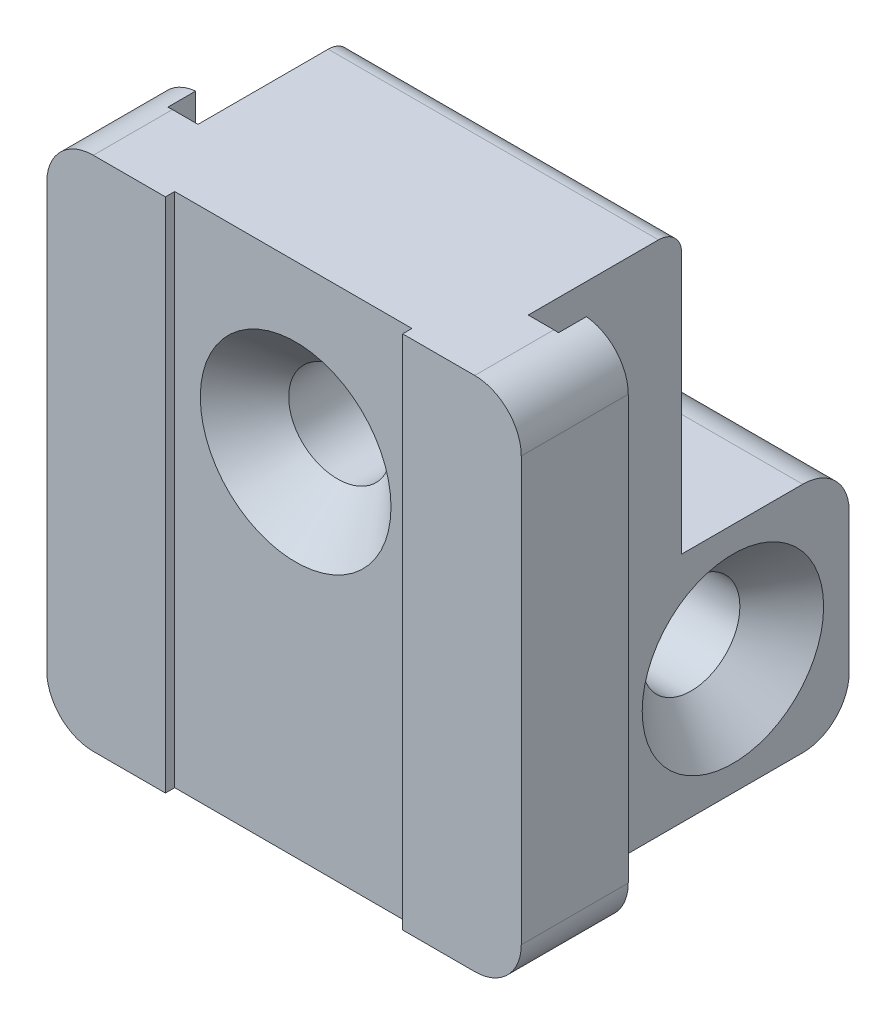
ISO-10303-21;
HEADER;
FILE_DESCRIPTION(('STEP AP214'),'2;1');
FILE_NAME('part.step','',(''),(''),'','','');
FILE_SCHEMA(('AUTOMOTIVE_DESIGN { 1 0 10303 214 1 1 1 1 }'));
ENDSEC;
DATA;
#1=APPLICATION_CONTEXT('core data for automotive mechanical design processes');
#2=APPLICATION_PROTOCOL_DEFINITION('international standard','automotive_design',2000,#1);
#3=PRODUCT_CONTEXT('',#1,'mechanical');
#4=PRODUCT('Part','Part','',(#3));
#5=PRODUCT_RELATED_PRODUCT_CATEGORY('part','',(#4));
#6=PRODUCT_DEFINITION_FORMATION('','',#4);
#7=PRODUCT_DEFINITION_CONTEXT('part definition',#1,'design');
#8=PRODUCT_DEFINITION('design','',#6,#7);
#9=PRODUCT_DEFINITION_SHAPE('','',#8);
#10=(LENGTH_UNIT() NAMED_UNIT(*) SI_UNIT(.MILLI.,.METRE.));
#11=(NAMED_UNIT(*) PLANE_ANGLE_UNIT() SI_UNIT($,.RADIAN.));
#12=(NAMED_UNIT(*) SI_UNIT($,.STERADIAN.) SOLID_ANGLE_UNIT());
#13=UNCERTAINTY_MEASURE_WITH_UNIT(LENGTH_MEASURE(1.E-05),#10,'distance_accuracy_value','');
#14=(GEOMETRIC_REPRESENTATION_CONTEXT(3) GLOBAL_UNCERTAINTY_ASSIGNED_CONTEXT((#13)) GLOBAL_UNIT_ASSIGNED_CONTEXT((#10,
#11,#12)) REPRESENTATION_CONTEXT('',''));
#15=CARTESIAN_POINT('',(0.,0.,0.));
#16=DIRECTION('',(0.,0.,1.));
#17=DIRECTION('',(1.,0.,0.));
#18=AXIS2_PLACEMENT_3D('',#15,#16,#17);
#19=CARTESIAN_POINT('',(4.04999999999992,-6.55000000000003,0.));
#20=DIRECTION('',(0.,0.,-1.));
#21=DIRECTION('',(0.,1.,0.));
#22=AXIS2_PLACEMENT_3D('',#19,#20,#21);
#23=CYLINDRICAL_SURFACE('',#22,1.00000000000002);
#24=CARTESIAN_POINT('',(4.04999999999992,-6.55000000000004,-2.3));
#25=DIRECTION('',(0.,0.,-1.));
#26=DIRECTION('',(0.,1.,0.));
#27=AXIS2_PLACEMENT_3D('',#24,#25,#26);
#28=CIRCLE('',#27,1.00000000000002);
#29=CARTESIAN_POINT('',(4.15,-7.54498743710703,-2.3));
#30=VERTEX_POINT('',#29);
#31=CARTESIAN_POINT('',(5.05,-6.55000000000002,-2.3));
#32=VERTEX_POINT('',#31);
#33=EDGE_CURVE('E319',#30,#32,#28,.F.);
#34=ORIENTED_EDGE('',*,*,#33,.T.);
#35=DIRECTION('',(0.,0.,-1.));
#36=VECTOR('',#35,1.);
#37=CARTESIAN_POINT('',(5.05,-6.55,-1.54250022917986));
#38=LINE('',#37,#36);
#39=CARTESIAN_POINT('',(5.05,-6.55000000000002,0.));
#40=VERTEX_POINT('',#39);
#41=EDGE_CURVE('E318',#40,#32,#38,.T.);
#42=ORIENTED_EDGE('',*,*,#41,.F.);
#43=CARTESIAN_POINT('',(4.04999999999992,-6.55000000000003,0.));
#44=DIRECTION('',(0.,0.,-1.));
#45=DIRECTION('',(0.,1.,0.));
#46=AXIS2_PLACEMENT_3D('',#43,#44,#45);
#47=CIRCLE('',#46,1.00000000000002);
#48=CARTESIAN_POINT('',(4.04999999999996,-7.55,0.));
#49=VERTEX_POINT('',#48);
#50=EDGE_CURVE('E311',#40,#49,#47,.T.);
#51=ORIENTED_EDGE('',*,*,#50,.T.);
#52=DIRECTION('',(0.,0.,-1.));
#53=VECTOR('',#52,1.);
#54=CARTESIAN_POINT('',(4.05,-7.55,-1.15));
#55=LINE('',#54,#53);
#56=CARTESIAN_POINT('',(4.04999999999996,-7.55,-1.7));
#57=VERTEX_POINT('',#56);
#58=EDGE_CURVE('E307',#49,#57,#55,.T.);
#59=ORIENTED_EDGE('',*,*,#58,.T.);
#60=CARTESIAN_POINT('',(4.04999999999992,-6.55000000000004,-1.7));
#61=DIRECTION('',(0.,0.,-1.));
#62=DIRECTION('',(0.,1.,0.));
#63=AXIS2_PLACEMENT_3D('',#60,#61,#62);
#64=CIRCLE('',#63,1.00000000000002);
#65=CARTESIAN_POINT('',(4.15,-7.54498743710703,-1.7));
#66=VERTEX_POINT('',#65);
#67=EDGE_CURVE('E310',#57,#66,#64,.F.);
#68=ORIENTED_EDGE('',*,*,#67,.T.);
#69=DIRECTION('',(0.,0.,-1.));
#70=VECTOR('',#69,1.);
#71=CARTESIAN_POINT('',(4.15,-7.54498743710739,-1.7));
#72=LINE('',#71,#70);
#73=EDGE_CURVE('E351',#66,#30,#72,.T.);
#74=ORIENTED_EDGE('',*,*,#73,.T.);
#75=EDGE_LOOP('',(#34,#42,#51,#59,#68,#74));
#76=FACE_BOUND('',#75,.T.);
#77=ADVANCED_FACE('F43',(#76),#23,.T.);
#78=CARTESIAN_POINT('',(4.04999999999993,2.55000000000003,0.));
#79=DIRECTION('',(0.,0.,-1.));
#80=DIRECTION('',(-1.,0.,0.));
#81=AXIS2_PLACEMENT_3D('',#78,#79,#80);
#82=CYLINDRICAL_SURFACE('',#81,1.00000000000002);
#83=CARTESIAN_POINT('',(4.04999999999993,2.55000000000003,-1.7));
#84=DIRECTION('',(0.,0.,-1.));
#85=DIRECTION('',(-1.,0.,0.));
#86=AXIS2_PLACEMENT_3D('',#83,#84,#85);
#87=CIRCLE('',#86,1.00000000000002);
#88=CARTESIAN_POINT('',(4.15,3.54498743710702,-1.7));
#89=VERTEX_POINT('',#88);
#90=CARTESIAN_POINT('',(4.04999999999996,3.55,-1.7));
#91=VERTEX_POINT('',#90);
#92=EDGE_CURVE('E344',#89,#91,#87,.F.);
#93=ORIENTED_EDGE('',*,*,#92,.T.);
#94=DIRECTION('',(0.,0.,1.));
#95=VECTOR('',#94,1.);
#96=CARTESIAN_POINT('',(4.05,3.55,-1.15));
#97=LINE('',#96,#95);
#98=CARTESIAN_POINT('',(4.04999999999996,3.55,0.));
#99=VERTEX_POINT('',#98);
#100=EDGE_CURVE('E305',#91,#99,#97,.T.);
#101=ORIENTED_EDGE('',*,*,#100,.T.);
#102=CARTESIAN_POINT('',(4.04999999999993,2.55000000000003,0.));
#103=DIRECTION('',(0.,0.,-1.));
#104=DIRECTION('',(-1.,0.,0.));
#105=AXIS2_PLACEMENT_3D('',#102,#103,#104);
#106=CIRCLE('',#105,1.00000000000002);
#107=CARTESIAN_POINT('',(5.05,2.55000000000002,0.));
#108=VERTEX_POINT('',#107);
#109=EDGE_CURVE('E349',#99,#108,#106,.T.);
#110=ORIENTED_EDGE('',*,*,#109,.T.);
#111=DIRECTION('',(0.,0.,1.));
#112=VECTOR('',#111,1.);
#113=CARTESIAN_POINT('',(5.05,2.55,-1.54250022917986));
#114=LINE('',#113,#112);
#115=CARTESIAN_POINT('',(5.05,2.55000000000002,-2.3));
#116=VERTEX_POINT('',#115);
#117=EDGE_CURVE('E476',#116,#108,#114,.T.);
#118=ORIENTED_EDGE('',*,*,#117,.F.);
#119=CARTESIAN_POINT('',(4.04999999999993,2.55000000000003,-2.3));
#120=DIRECTION('',(0.,0.,-1.));
#121=DIRECTION('',(-1.,0.,0.));
#122=AXIS2_PLACEMENT_3D('',#119,#120,#121);
#123=CIRCLE('',#122,1.00000000000002);
#124=CARTESIAN_POINT('',(4.15,3.54498743710702,-2.3));
#125=VERTEX_POINT('',#124);
#126=EDGE_CURVE('E315',#116,#125,#123,.F.);
#127=ORIENTED_EDGE('',*,*,#126,.T.);
#128=DIRECTION('',(0.,0.,-1.));
#129=VECTOR('',#128,1.);
#130=CARTESIAN_POINT('',(4.15,3.54498743710738,-2.3));
#131=LINE('',#130,#129);
#132=EDGE_CURVE('E347',#125,#89,#131,.F.);
#133=ORIENTED_EDGE('',*,*,#132,.T.);
#134=EDGE_LOOP('',(#93,#101,#110,#118,#127,#133));
#135=FACE_BOUND('',#134,.T.);
#136=ADVANCED_FACE('F700',(#135),#82,.T.);
#137=CARTESIAN_POINT('',(-4.14999999999992,-6.54999999999996,-2.29999999999995));
#138=DIRECTION('',(0.,0.,1.));
#139=DIRECTION('',(1.,0.,0.));
#140=AXIS2_PLACEMENT_3D('',#137,#138,#139);
#141=CYLINDRICAL_SURFACE('',#140,1.00000000000006);
#142=CARTESIAN_POINT('',(-4.15000000000004,-6.55000000000007,0.));
#143=DIRECTION('',(0.,0.,1.));
#144=DIRECTION('',(1.,0.,0.));
#145=AXIS2_PLACEMENT_3D('',#142,#143,#144);
#146=CIRCLE('',#145,1.00000000000006);
#147=CARTESIAN_POINT('',(-4.15000000000002,-7.55,0.));
#148=VERTEX_POINT('',#147);
#149=CARTESIAN_POINT('',(-5.15,-6.55000000000004,0.));
#150=VERTEX_POINT('',#149);
#151=EDGE_CURVE('E335',#148,#150,#146,.F.);
#152=ORIENTED_EDGE('',*,*,#151,.T.);
#153=DIRECTION('',(0.,0.,1.));
#154=VECTOR('',#153,1.);
#155=CARTESIAN_POINT('',(-5.15,-6.55,-1.54250022917986));
#156=LINE('',#155,#154);
#157=CARTESIAN_POINT('',(-5.15,-6.54999999999998,-2.3));
#158=VERTEX_POINT('',#157);
#159=EDGE_CURVE('E473',#158,#150,#156,.T.);
#160=ORIENTED_EDGE('',*,*,#159,.F.);
#161=CARTESIAN_POINT('',(-4.14999999999992,-6.54999999999996,-2.29999999999995));
#162=DIRECTION('',(0.,0.,1.));
#163=DIRECTION('',(1.,0.,0.));
#164=AXIS2_PLACEMENT_3D('',#161,#162,#163);
#165=CIRCLE('',#164,1.00000000000006);
#166=CARTESIAN_POINT('',(-4.25,-7.54498743710698,-2.29999999999998));
#167=VERTEX_POINT('',#166);
#168=EDGE_CURVE('E323',#158,#167,#165,.T.);
#169=ORIENTED_EDGE('',*,*,#168,.T.);
#170=DIRECTION('',(0.,0.,1.));
#171=VECTOR('',#170,1.);
#172=CARTESIAN_POINT('',(-4.25,-7.54498743710734,-2.3));
#173=LINE('',#172,#171);
#174=CARTESIAN_POINT('',(-4.25000000000002,-7.54498743710702,-1.7));
#175=VERTEX_POINT('',#174);
#176=EDGE_CURVE('E341',#167,#175,#173,.T.);
#177=ORIENTED_EDGE('',*,*,#176,.T.);
#178=CARTESIAN_POINT('',(-4.14999999999996,-6.54999999999999,-1.69999999999995));
#179=DIRECTION('',(0.,0.,1.));
#180=DIRECTION('',(1.,0.,0.));
#181=AXIS2_PLACEMENT_3D('',#178,#179,#180);
#182=CIRCLE('',#181,1.00000000000006);
#183=CARTESIAN_POINT('',(-4.14999999999998,-7.55,-1.7));
#184=VERTEX_POINT('',#183);
#185=EDGE_CURVE('E338',#175,#184,#182,.T.);
#186=ORIENTED_EDGE('',*,*,#185,.T.);
#187=DIRECTION('',(0.,0.,1.));
#188=VECTOR('',#187,1.);
#189=CARTESIAN_POINT('',(-4.15,-7.55,-1.15));
#190=LINE('',#189,#188);
#191=EDGE_CURVE('E337',#184,#148,#190,.T.);
#192=ORIENTED_EDGE('',*,*,#191,.T.);
#193=EDGE_LOOP('',(#152,#160,#169,#177,#186,#192));
#194=FACE_BOUND('',#193,.T.);
#195=ADVANCED_FACE('F500',(#194),#141,.T.);
#196=CARTESIAN_POINT('',(-4.14999999999993,2.54999999999995,-2.29999999999995));
#197=DIRECTION('',(0.,0.,1.));
#198=DIRECTION('',(1.,0.,0.));
#199=AXIS2_PLACEMENT_3D('',#196,#197,#198);
#200=CYLINDRICAL_SURFACE('',#199,1.00000000000006);
#201=CARTESIAN_POINT('',(-4.15000000000004,2.55000000000007,0.));
#202=DIRECTION('',(0.,0.,1.));
#203=DIRECTION('',(1.,0.,0.));
#204=AXIS2_PLACEMENT_3D('',#201,#202,#203);
#205=CIRCLE('',#204,1.00000000000006);
#206=CARTESIAN_POINT('',(-5.15,2.55000000000003,0.));
#207=VERTEX_POINT('',#206);
#208=CARTESIAN_POINT('',(-4.15000000000002,3.55,0.));
#209=VERTEX_POINT('',#208);
#210=EDGE_CURVE('E327',#207,#209,#205,.F.);
#211=ORIENTED_EDGE('',*,*,#210,.T.);
#212=DIRECTION('',(0.,0.,-1.));
#213=VECTOR('',#212,1.);
#214=CARTESIAN_POINT('',(-4.15,3.55,-1.15));
#215=LINE('',#214,#213);
#216=CARTESIAN_POINT('',(-4.14999999999998,3.55,-1.7));
#217=VERTEX_POINT('',#216);
#218=EDGE_CURVE('E326',#209,#217,#215,.T.);
#219=ORIENTED_EDGE('',*,*,#218,.T.);
#220=CARTESIAN_POINT('',(-4.14999999999996,2.54999999999998,-1.69999999999995));
#221=DIRECTION('',(0.,0.,1.));
#222=DIRECTION('',(1.,0.,0.));
#223=AXIS2_PLACEMENT_3D('',#220,#221,#222);
#224=CIRCLE('',#223,1.00000000000006);
#225=CARTESIAN_POINT('',(-4.25,3.54498743710701,-1.7));
#226=VERTEX_POINT('',#225);
#227=EDGE_CURVE('E332',#217,#226,#224,.T.);
#228=ORIENTED_EDGE('',*,*,#227,.T.);
#229=DIRECTION('',(0.,0.,1.));
#230=VECTOR('',#229,1.);
#231=CARTESIAN_POINT('',(-4.25,3.54498743710737,-1.7));
#232=LINE('',#231,#230);
#233=CARTESIAN_POINT('',(-4.24999999999999,3.54498743710698,-2.29999999999997));
#234=VERTEX_POINT('',#233);
#235=EDGE_CURVE('E330',#226,#234,#232,.F.);
#236=ORIENTED_EDGE('',*,*,#235,.T.);
#237=CARTESIAN_POINT('',(-4.14999999999993,2.54999999999995,-2.29999999999994));
#238=DIRECTION('',(0.,0.,1.));
#239=DIRECTION('',(1.,0.,0.));
#240=AXIS2_PLACEMENT_3D('',#237,#238,#239);
#241=CIRCLE('',#240,1.00000000000006);
#242=CARTESIAN_POINT('',(-5.15,2.54999999999998,-2.3));
#243=VERTEX_POINT('',#242);
#244=EDGE_CURVE('E321',#234,#243,#241,.T.);
#245=ORIENTED_EDGE('',*,*,#244,.T.);
#246=DIRECTION('',(0.,0.,-1.));
#247=VECTOR('',#246,1.);
#248=CARTESIAN_POINT('',(-5.15,2.55,-1.54250022917986));
#249=LINE('',#248,#247);
#250=EDGE_CURVE('E469',#207,#243,#249,.T.);
#251=ORIENTED_EDGE('',*,*,#250,.F.);
#252=EDGE_LOOP('',(#211,#219,#228,#236,#245,#251));
#253=FACE_BOUND('',#252,.T.);
#254=ADVANCED_FACE('F699',(#253),#200,.T.);
#255=CARTESIAN_POINT('',(-5.15,-7.55,-2.3));
#256=DIRECTION('',(0.,0.,1.));
#257=DIRECTION('',(1.,0.,0.));
#258=AXIS2_PLACEMENT_3D('',#255,#256,#257);
#259=PLANE('',#258);
#260=ORIENTED_EDGE('',*,*,#244,.F.);
#261=DIRECTION('',(0.,-1.,0.));
#262=VECTOR('',#261,1.);
#263=CARTESIAN_POINT('',(-4.25,-1.71199356377125,-2.3));
#264=LINE('',#263,#262);
#265=EDGE_CURVE('E376',#234,#167,#264,.T.);
#266=ORIENTED_EDGE('',*,*,#265,.T.);
#267=ORIENTED_EDGE('',*,*,#168,.F.);
#268=DIRECTION('',(0.,-1.,0.));
#269=VECTOR('',#268,1.);
#270=CARTESIAN_POINT('',(-5.15,-2.00000081658365,-2.3));
#271=LINE('',#270,#269);
#272=EDGE_CURVE('E472',#243,#158,#271,.T.);
#273=ORIENTED_EDGE('',*,*,#272,.F.);
#274=EDGE_LOOP('',(#260,#266,#267,#273));
#275=FACE_BOUND('',#274,.T.);
#276=ADVANCED_FACE('F732',(#275),#259,.F.);
#277=CARTESIAN_POINT('',(4.15,-7.55,-2.3));
#278=DIRECTION('',(0.,0.,1.));
#279=DIRECTION('',(1.,0.,0.));
#280=AXIS2_PLACEMENT_3D('',#277,#278,#279);
#281=PLANE('',#280);
#282=ORIENTED_EDGE('',*,*,#126,.F.);
#283=DIRECTION('',(0.,1.,0.));
#284=VECTOR('',#283,1.);
#285=CARTESIAN_POINT('',(5.05,-2.00000081658365,-2.3));
#286=LINE('',#285,#284);
#287=EDGE_CURVE('E483',#32,#116,#286,.T.);
#288=ORIENTED_EDGE('',*,*,#287,.F.);
#289=ORIENTED_EDGE('',*,*,#33,.F.);
#290=DIRECTION('',(0.,1.,0.));
#291=VECTOR('',#290,1.);
#292=CARTESIAN_POINT('',(4.15,-1.71199356377125,-2.3));
#293=LINE('',#292,#291);
#294=EDGE_CURVE('E261',#30,#125,#293,.T.);
#295=ORIENTED_EDGE('',*,*,#294,.T.);
#296=EDGE_LOOP('',(#282,#288,#289,#295));
#297=FACE_BOUND('',#296,.T.);
#298=ADVANCED_FACE('F690',(#297),#281,.F.);
#299=CARTESIAN_POINT('',(5.05,-7.82750223279,-3.3));
#300=DIRECTION('',(1.,0.,0.));
#301=DIRECTION('',(0.,1.,0.));
#302=AXIS2_PLACEMENT_3D('',#299,#300,#301);
#303=PLANE('',#302);
#304=ORIENTED_EDGE('',*,*,#117,.T.);
#305=DIRECTION('',(0.,1.,0.));
#306=VECTOR('',#305,1.);
#307=CARTESIAN_POINT('',(5.05,-2.,0.));
#308=LINE('',#307,#306);
#309=EDGE_CURVE('E455',#40,#108,#308,.T.);
#310=ORIENTED_EDGE('',*,*,#309,.F.);
#311=ORIENTED_EDGE('',*,*,#41,.T.);
#312=ORIENTED_EDGE('',*,*,#287,.T.);
#313=EDGE_LOOP('',(#304,#310,#311,#312));
#314=FACE_BOUND('',#313,.T.);
#315=ADVANCED_FACE('F681',(#314),#303,.T.);
#316=CARTESIAN_POINT('',(-5.15,3.8275005996227,0.21499954164029));
#317=DIRECTION('',(-1.,0.,0.));
#318=DIRECTION('',(0.,0.,-1.));
#319=AXIS2_PLACEMENT_3D('',#316,#317,#318);
#320=PLANE('',#319);
#321=ORIENTED_EDGE('',*,*,#250,.T.);
#322=ORIENTED_EDGE('',*,*,#272,.T.);
#323=ORIENTED_EDGE('',*,*,#159,.T.);
#324=DIRECTION('',(0.,-1.,0.));
#325=VECTOR('',#324,1.);
#326=CARTESIAN_POINT('',(-5.15,-2.,0.));
#327=LINE('',#326,#325);
#328=EDGE_CURVE('E447',#207,#150,#327,.T.);
#329=ORIENTED_EDGE('',*,*,#328,.F.);
#330=EDGE_LOOP('',(#321,#322,#323,#329));
#331=FACE_BOUND('',#330,.T.);
#332=ADVANCED_FACE('F673',(#331),#320,.T.);
#333=CARTESIAN_POINT('',(-4.25,-7.55,-2.3));
#334=DIRECTION('',(-1.,0.,0.));
#335=DIRECTION('',(0.,0.,1.));
#336=AXIS2_PLACEMENT_3D('',#333,#334,#335);
#337=PLANE('',#336);
#338=ORIENTED_EDGE('',*,*,#235,.F.);
#339=DIRECTION('',(0.,-1.,0.));
#340=VECTOR('',#339,1.);
#341=CARTESIAN_POINT('',(-4.25,-1.71199356377125,-1.7));
#342=LINE('',#341,#340);
#343=EDGE_CURVE('E282',#226,#175,#342,.T.);
#344=ORIENTED_EDGE('',*,*,#343,.T.);
#345=ORIENTED_EDGE('',*,*,#176,.F.);
#346=ORIENTED_EDGE('',*,*,#265,.F.);
#347=EDGE_LOOP('',(#338,#344,#345,#346));
#348=FACE_BOUND('',#347,.T.);
#349=ADVANCED_FACE('F625',(#348),#337,.F.);
#350=CARTESIAN_POINT('',(-5.15000000000005,-3.55000000000004,-7.6));
#351=DIRECTION('',(1.,0.,0.));
#352=DIRECTION('',(0.,0.,-1.));
#353=AXIS2_PLACEMENT_3D('',#350,#351,#352);
#354=CYLINDRICAL_SURFACE('',#353,1.00000000000002);
#355=CARTESIAN_POINT('',(3.5,-3.55000000000044,-7.59999999999961));
#356=DIRECTION('',(-1.,0.,0.));
#357=DIRECTION('',(0.,0.,1.));
#358=AXIS2_PLACEMENT_3D('',#355,#356,#357);
#359=CIRCLE('',#358,1.00000000000002);
#360=CARTESIAN_POINT('',(3.5,-2.55,-7.6));
#361=VERTEX_POINT('',#360);
#362=CARTESIAN_POINT('',(3.5,-3.55,-8.6));
#363=VERTEX_POINT('',#362);
#364=EDGE_CURVE('E259',#361,#363,#359,.T.);
#365=ORIENTED_EDGE('',*,*,#364,.T.);
#366=DIRECTION('',(1.,0.,0.));
#367=VECTOR('',#366,1.);
#368=CARTESIAN_POINT('',(-0.0500000000000001,-3.55,-8.6));
#369=LINE('',#368,#367);
#370=CARTESIAN_POINT('',(-3.6,-3.55,-8.6));
#371=VERTEX_POINT('',#370);
#372=EDGE_CURVE('E289',#371,#363,#369,.T.);
#373=ORIENTED_EDGE('',*,*,#372,.F.);
#374=CARTESIAN_POINT('',(-3.6,-3.55000000000011,-7.59999999999993));
#375=DIRECTION('',(1.,0.,0.));
#376=DIRECTION('',(0.,0.,-1.));
#377=AXIS2_PLACEMENT_3D('',#374,#375,#376);
#378=CIRCLE('',#377,1.00000000000002);
#379=CARTESIAN_POINT('',(-3.6,-2.55,-7.6));
#380=VERTEX_POINT('',#379);
#381=EDGE_CURVE('E262',#371,#380,#378,.T.);
#382=ORIENTED_EDGE('',*,*,#381,.T.);
#383=DIRECTION('',(-1.,0.,0.));
#384=VECTOR('',#383,1.);
#385=CARTESIAN_POINT('',(-0.0500000000000001,-2.55,-7.6));
#386=LINE('',#385,#384);
#387=EDGE_CURVE('E272',#361,#380,#386,.T.);
#388=ORIENTED_EDGE('',*,*,#387,.F.);
#389=EDGE_LOOP('',(#365,#373,#382,#388));
#390=FACE_BOUND('',#389,.T.);
#391=ADVANCED_FACE('F390',(#390),#354,.T.);
#392=CARTESIAN_POINT('',(4.15,-7.55,-1.7));
#393=DIRECTION('',(1.,0.,0.));
#394=DIRECTION('',(0.,0.,-1.));
#395=AXIS2_PLACEMENT_3D('',#392,#393,#394);
#396=PLANE('',#395);
#397=ORIENTED_EDGE('',*,*,#132,.F.);
#398=ORIENTED_EDGE('',*,*,#294,.F.);
#399=ORIENTED_EDGE('',*,*,#73,.F.);
#400=DIRECTION('',(0.,1.,0.));
#401=VECTOR('',#400,1.);
#402=CARTESIAN_POINT('',(4.15,-1.71199356377125,-1.7));
#403=LINE('',#402,#401);
#404=EDGE_CURVE('E291',#66,#89,#403,.T.);
#405=ORIENTED_EDGE('',*,*,#404,.T.);
#406=EDGE_LOOP('',(#397,#398,#399,#405));
#407=FACE_BOUND('',#406,.T.);
#408=ADVANCED_FACE('F624',(#407),#396,.F.);
#409=CARTESIAN_POINT('',(-3.7,-5.05,-6.10000000000005));
#410=DIRECTION('',(1.,0.,0.));
#411=DIRECTION('',(0.,0.,-1.));
#412=AXIS2_PLACEMENT_3D('',#409,#410,#411);
#413=CYLINDRICAL_SURFACE('',#412,1.04999999999997);
#414=CARTESIAN_POINT('',(2.6,-5.05,-6.10000000000005));
#415=DIRECTION('',(1.,0.,0.));
#416=DIRECTION('',(0.,0.,-1.));
#417=AXIS2_PLACEMENT_3D('',#414,#415,#416);
#418=CIRCLE('',#417,1.04999999999997);
#419=CARTESIAN_POINT('',(2.6,-5.05,-7.15000000000002));
#420=VERTEX_POINT('',#419);
#421=EDGE_CURVE('E301',#420,#420,#418,.T.);
#422=ORIENTED_EDGE('',*,*,#421,.T.);
#423=EDGE_LOOP('',(#422));
#424=FACE_BOUND('',#423,.T.);
#425=CARTESIAN_POINT('',(-2.7,-5.05,-6.10000000000005));
#426=DIRECTION('',(-1.,0.,0.));
#427=DIRECTION('',(0.,0.,1.));
#428=AXIS2_PLACEMENT_3D('',#425,#426,#427);
#429=CIRCLE('',#428,1.05000000000001);
#430=CARTESIAN_POINT('',(-2.7,-5.05,-5.05000000000004));
#431=VERTEX_POINT('',#430);
#432=EDGE_CURVE('E275',#431,#431,#429,.T.);
#433=ORIENTED_EDGE('',*,*,#432,.T.);
#434=EDGE_LOOP('',(#433));
#435=FACE_BOUND('',#434,.T.);
#436=ADVANCED_FACE('F638',(#424,#435),#413,.F.);
#437=CARTESIAN_POINT('',(-5.15,3.55,0.));
#438=DIRECTION('',(0.,0.,1.));
#439=DIRECTION('',(0.,-1.,0.));
#440=AXIS2_PLACEMENT_3D('',#437,#438,#439);
#441=PLANE('',#440);
#442=ORIENTED_EDGE('',*,*,#109,.F.);
#443=DIRECTION('',(-1.,0.,0.));
#444=VECTOR('',#443,1.);
#445=CARTESIAN_POINT('',(-0.0500000000000001,3.55,0.));
#446=LINE('',#445,#444);
#447=CARTESIAN_POINT('',(2.5,3.55,0.));
#448=VERTEX_POINT('',#447);
#449=EDGE_CURVE('E453',#99,#448,#446,.T.);
#450=ORIENTED_EDGE('',*,*,#449,.T.);
#451=DIRECTION('',(0.,-1.,0.));
#452=VECTOR('',#451,1.);
#453=CARTESIAN_POINT('',(2.5,-2.,0.));
#454=LINE('',#453,#452);
#455=CARTESIAN_POINT('',(2.5,-7.55,0.));
#456=VERTEX_POINT('',#455);
#457=EDGE_CURVE('E430',#448,#456,#454,.T.);
#458=ORIENTED_EDGE('',*,*,#457,.T.);
#459=DIRECTION('',(1.,0.,0.));
#460=VECTOR('',#459,1.);
#461=CARTESIAN_POINT('',(-0.0500000000000001,-7.55,0.));
#462=LINE('',#461,#460);
#463=EDGE_CURVE('E458',#456,#49,#462,.T.);
#464=ORIENTED_EDGE('',*,*,#463,.T.);
#465=ORIENTED_EDGE('',*,*,#50,.F.);
#466=ORIENTED_EDGE('',*,*,#309,.T.);
#467=EDGE_LOOP('',(#442,#450,#458,#464,#465,#466));
#468=FACE_BOUND('',#467,.T.);
#469=ADVANCED_FACE('F520',(#468),#441,.T.);
#470=CARTESIAN_POINT('',(-5.15,3.55,0.));
#471=DIRECTION('',(0.,0.,1.));
#472=DIRECTION('',(0.,-1.,0.));
#473=AXIS2_PLACEMENT_3D('',#470,#471,#472);
#474=PLANE('',#473);
#475=ORIENTED_EDGE('',*,*,#151,.F.);
#476=DIRECTION('',(1.,0.,0.));
#477=VECTOR('',#476,1.);
#478=CARTESIAN_POINT('',(-0.0500000000000001,-7.55,0.));
#479=LINE('',#478,#477);
#480=CARTESIAN_POINT('',(-2.6,-7.55,0.));
#481=VERTEX_POINT('',#480);
#482=EDGE_CURVE('E365',#148,#481,#479,.T.);
#483=ORIENTED_EDGE('',*,*,#482,.T.);
#484=DIRECTION('',(0.,1.,0.));
#485=VECTOR('',#484,1.);
#486=CARTESIAN_POINT('',(-2.6,-2.,0.));
#487=LINE('',#486,#485);
#488=CARTESIAN_POINT('',(-2.6,3.55,0.));
#489=VERTEX_POINT('',#488);
#490=EDGE_CURVE('E465',#481,#489,#487,.T.);
#491=ORIENTED_EDGE('',*,*,#490,.T.);
#492=DIRECTION('',(-1.,0.,0.));
#493=VECTOR('',#492,1.);
#494=CARTESIAN_POINT('',(-0.0500000000000001,3.55,0.));
#495=LINE('',#494,#493);
#496=EDGE_CURVE('E450',#489,#209,#495,.T.);
#497=ORIENTED_EDGE('',*,*,#496,.T.);
#498=ORIENTED_EDGE('',*,*,#210,.F.);
#499=ORIENTED_EDGE('',*,*,#328,.T.);
#500=EDGE_LOOP('',(#475,#483,#491,#497,#498,#499));
#501=FACE_BOUND('',#500,.T.);
#502=ADVANCED_FACE('F513',(#501),#474,.T.);
#503=CARTESIAN_POINT('',(-5.15000000000005,3.04999999999993,-4.50000000000007));
#504=DIRECTION('',(1.,0.,0.));
#505=DIRECTION('',(0.,0.,-1.));
#506=AXIS2_PLACEMENT_3D('',#503,#504,#505);
#507=CYLINDRICAL_SURFACE('',#506,0.500000000000002);
#508=CARTESIAN_POINT('',(3.5,3.04999999999913,-4.49999999999927));
#509=DIRECTION('',(-1.,0.,0.));
#510=DIRECTION('',(0.,0.,1.));
#511=AXIS2_PLACEMENT_3D('',#508,#509,#510);
#512=CIRCLE('',#511,0.500000000000002);
#513=CARTESIAN_POINT('',(3.5,3.55,-4.5));
#514=VERTEX_POINT('',#513);
#515=CARTESIAN_POINT('',(3.5,3.05,-5.));
#516=VERTEX_POINT('',#515);
#517=EDGE_CURVE('E250',#514,#516,#512,.T.);
#518=ORIENTED_EDGE('',*,*,#517,.T.);
#519=DIRECTION('',(1.,0.,0.));
#520=VECTOR('',#519,1.);
#521=CARTESIAN_POINT('',(-0.0500000000000001,3.05,-5.));
#522=LINE('',#521,#520);
#523=CARTESIAN_POINT('',(-3.6,3.05,-5.));
#524=VERTEX_POINT('',#523);
#525=EDGE_CURVE('E267',#524,#516,#522,.T.);
#526=ORIENTED_EDGE('',*,*,#525,.F.);
#527=CARTESIAN_POINT('',(-3.6,3.04999999999979,-4.49999999999993));
#528=DIRECTION('',(1.,0.,0.));
#529=DIRECTION('',(0.,0.,-1.));
#530=AXIS2_PLACEMENT_3D('',#527,#528,#529);
#531=CIRCLE('',#530,0.500000000000002);
#532=CARTESIAN_POINT('',(-3.6,3.55,-4.5));
#533=VERTEX_POINT('',#532);
#534=EDGE_CURVE('E253',#524,#533,#531,.T.);
#535=ORIENTED_EDGE('',*,*,#534,.T.);
#536=DIRECTION('',(-1.,0.,0.));
#537=VECTOR('',#536,1.);
#538=CARTESIAN_POINT('',(-0.0500000000000001,3.55,-4.5));
#539=LINE('',#538,#537);
#540=EDGE_CURVE('E286',#514,#533,#539,.T.);
#541=ORIENTED_EDGE('',*,*,#540,.F.);
#542=EDGE_LOOP('',(#518,#526,#535,#541));
#543=FACE_BOUND('',#542,.T.);
#544=ADVANCED_FACE('F511',(#543),#507,.T.);
#545=CARTESIAN_POINT('',(-0.0499999999999931,0.,-5.));
#546=DIRECTION('',(0.,0.,1.));
#547=DIRECTION('',(1.,0.,0.));
#548=AXIS2_PLACEMENT_3D('',#545,#546,#547);
#549=CYLINDRICAL_SURFACE('',#548,1.05);
#550=CARTESIAN_POINT('',(-0.0499999999999931,0.,-5.));
#551=DIRECTION('',(0.,0.,1.));
#552=DIRECTION('',(1.,0.,0.));
#553=AXIS2_PLACEMENT_3D('',#550,#551,#552);
#554=CIRCLE('',#553,1.05);
#555=CARTESIAN_POINT('',(1.00000000000001,0.,-5.));
#556=VERTEX_POINT('',#555);
#557=EDGE_CURVE('E263',#556,#556,#554,.T.);
#558=ORIENTED_EDGE('',*,*,#557,.F.);
#559=EDGE_LOOP('',(#558));
#560=FACE_BOUND('',#559,.T.);
#561=CARTESIAN_POINT('',(1.00000000000001,0.,-1.25));
#562=CARTESIAN_POINT('',(0.999999674583375,-0.0494570909095807,-1.24999998226234));
#563=CARTESIAN_POINT('',(0.996498617991395,-0.0989184267058488,-1.24982488364115));
#564=CARTESIAN_POINT('',(0.98256535891875,-0.196873700953293,-1.24912858901044));
#565=CARTESIAN_POINT('',(0.972129009477458,-0.245367042711274,-1.24860718592816));
#566=CARTESIAN_POINT('',(0.941878746993389,-0.34949495976423,-1.24709780880387));
#567=CARTESIAN_POINT('',(0.920654667246219,-0.40472488839385,-1.2460397519009));
#568=CARTESIAN_POINT('',(0.869246549892919,-0.510847823992898,-1.24348275343322));
#569=CARTESIAN_POINT('',(0.839059000081115,-0.561739120852734,-1.24198363904865));
#570=CARTESIAN_POINT('',(0.770569217340101,-0.657757233467509,-1.23859209732889));
#571=CARTESIAN_POINT('',(0.732263101889838,-0.702881274551937,-1.23669948181891));
#572=CARTESIAN_POINT('',(0.648638654180958,-0.786054583312782,-1.23258152019453));
#573=CARTESIAN_POINT('',(0.603320866652663,-0.824104400074003,-1.2303561999281));
#574=CARTESIAN_POINT('',(0.506899951371814,-0.892102340423042,-1.22563894773388));
#575=CARTESIAN_POINT('',(0.455790101843866,-0.922040911363185,-1.22314670622798));
#576=CARTESIAN_POINT('',(0.349277886294134,-0.972913424987003,-1.21797340354991));
#577=CARTESIAN_POINT('',(0.293875432195996,-0.993847182850695,-1.21529233850351));
#578=CARTESIAN_POINT('',(0.180287530136,-1.02613719742775,-1.20981792767105));
#579=CARTESIAN_POINT('',(0.122099174685574,-1.0374832071093,-1.20702446508943));
#580=CARTESIAN_POINT('',(0.00464474578734729,-1.05023976170833,-1.20140884558558));
#581=CARTESIAN_POINT('',(-0.054621330522391,-1.05165028023779,-1.19858668858716));
#582=CARTESIAN_POINT('',(-0.172582253160505,-1.04449361970279,-1.19299193115185));
#583=CARTESIAN_POINT('',(-0.231276778874035,-1.0359211329414,-1.19021935787337));
#584=CARTESIAN_POINT('',(-0.346395620146511,-1.00903096410487,-1.18480194110575));
#585=CARTESIAN_POINT('',(-0.402819936754692,-0.99071328653377,-1.18215709755757));
#586=CARTESIAN_POINT('',(-0.511783072473601,-0.944854314327804,-1.1770672014773));
#587=CARTESIAN_POINT('',(-0.564322682662624,-0.917314903949137,-1.17462210825753));
#588=CARTESIAN_POINT('',(-0.664033401552039,-0.853789990520965,-1.16999597272344));
#589=CARTESIAN_POINT('',(-0.71120452829747,-0.817804515862387,-1.16781492952157));
#590=CARTESIAN_POINT('',(-0.798797626802037,-0.738439014197049,-1.16377541568339));
#591=CARTESIAN_POINT('',(-0.839224990228194,-0.695064951024734,-1.16191668730755));
#592=CARTESIAN_POINT('',(-0.912222882874464,-0.602131997177528,-1.1585674089616));
#593=CARTESIAN_POINT('',(-0.944793456681844,-0.552573141603745,-1.15707685690208));
#594=CARTESIAN_POINT('',(-1.00111735327254,-0.448732648554937,-1.15450312811481));
#595=CARTESIAN_POINT('',(-1.02487979389855,-0.394455967071379,-1.15341953010837));
#596=CARTESIAN_POINT('',(-1.06295585736558,-0.282677272080061,-1.15168477071788));
#597=CARTESIAN_POINT('',(-1.07726952858813,-0.225175275088855,-1.15103360711959));
#598=CARTESIAN_POINT('',(-1.09603065915686,-0.108630557623825,-1.15018035564417));
#599=CARTESIAN_POINT('',(-1.1004864660732,-0.0495891835878932,-1.14997788781438));
#600=CARTESIAN_POINT('',(-1.09942924744988,0.0684039676399825,-1.15002594339247));
#601=CARTESIAN_POINT('',(-1.09391624931389,0.127355745077776,-1.15027646555511));
#602=CARTESIAN_POINT('',(-1.07308246923804,0.24347615466456,-1.15122410444448));
#603=CARTESIAN_POINT('',(-1.05776490195284,0.300645364828813,-1.15192107479292));
#604=CARTESIAN_POINT('',(-1.01776226061593,0.411599277097626,-1.15374407552887));
#605=CARTESIAN_POINT('',(-0.993077180754104,0.465383977102948,-1.15487010618252));
#606=CARTESIAN_POINT('',(-0.935034067517921,0.568061359761705,-1.1575233822048));
#607=CARTESIAN_POINT('',(-0.901673307153657,0.616952497538704,-1.15905075372678));
#608=CARTESIAN_POINT('',(-0.827232548826485,0.708440165921412,-1.16246785521403));
#609=CARTESIAN_POINT('',(-0.78615251940014,0.751036670869182,-1.16435758665627));
#610=CARTESIAN_POINT('',(-0.697403481603179,0.828764833911999,-1.16845271232793));
#611=CARTESIAN_POINT('',(-0.649728978037521,0.863890203687023,-1.17065836987453));
#612=CARTESIAN_POINT('',(-0.549171661792149,0.925639730061637,-1.17532674439297));
#613=CARTESIAN_POINT('',(-0.496288822407534,0.952263843069435,-1.17778946268284));
#614=CARTESIAN_POINT('',(-0.386757378960051,0.99628398806543,-1.18290942707923));
#615=CARTESIAN_POINT('',(-0.330104924504749,1.01367041641059,-1.18556687237483));
#616=CARTESIAN_POINT('',(-0.214690444629577,1.03868361727786,-1.191002160107));
#617=CARTESIAN_POINT('',(-0.155928406555056,1.04631033124483,-1.19378000326581));
#618=CARTESIAN_POINT('',(-0.0379119265967792,1.05159195297562,-1.19938159129559));
#619=CARTESIAN_POINT('',(0.0213428767411001,1.04923874938198,-1.20220537164542));
#620=CARTESIAN_POINT('',(0.138616479764384,1.03460892570499,-1.20781660725298));
#621=CARTESIAN_POINT('',(0.196635274996617,1.02233226987498,-1.21060406237982));
#622=CARTESIAN_POINT('',(0.309803257115792,0.98819808477148,-1.21606231912563));
#623=CARTESIAN_POINT('',(0.364951774420669,0.966338331048663,-1.21873309350203));
#624=CARTESIAN_POINT('',(0.470795828850998,0.913655398455621,-1.22387766784295));
#625=CARTESIAN_POINT('',(0.521491462796744,0.882832414538275,-1.22635147209015));
#626=CARTESIAN_POINT('',(0.616960254213295,0.81311491531017,-1.23102529868003));
#627=CARTESIAN_POINT('',(0.661736747244953,0.774224977917969,-1.23322547517599));
#628=CARTESIAN_POINT('',(0.744129573490952,0.689457577838466,-1.23728524526309));
#629=CARTESIAN_POINT('',(0.781745051704148,0.643579281940312,-1.23914479818391));
#630=CARTESIAN_POINT('',(0.848705238129724,0.54618615505978,-1.24246229110238));
#631=CARTESIAN_POINT('',(0.878056785704158,0.494676034380296,-1.24392056318375));
#632=CARTESIAN_POINT('',(0.927677899929183,0.387466421479326,-1.24638964412397));
#633=CARTESIAN_POINT('',(0.947952952368679,0.331769483590496,-1.24740072325958));
#634=CARTESIAN_POINT('',(0.9755385980373,0.230049785772768,-1.2487774978047));
#635=CARTESIAN_POINT('',(0.984698738510764,0.184519663265283,-1.24923518396046));
#636=CARTESIAN_POINT('',(0.996928280740544,0.09266070060423,-1.24984637788481));
#637=CARTESIAN_POINT('',(1.00000030485563,0.0463322130113167,-1.25000001661693));
#638=CARTESIAN_POINT('',(1.00000000000001,0.,-1.25));
#639=B_SPLINE_CURVE_WITH_KNOTS('',3,(#561,#562,#563,#564,#565,#566,#567,#568,#569,#570,#571,
#572,#573,#574,#575,#576,#577,#578,#579,#580,#581,#582,#583,#584,#585,#586,#587,#588,#589,#590,
#591,#592,#593,#594,#595,#596,#597,#598,#599,#600,#601,#602,#603,#604,#605,#606,#607,#608,#609,
#610,#611,#612,#613,#614,#615,#616,#617,#618,#619,#620,#621,#622,#623,#624,#625,#626,#627,#628,
#629,#630,#631,#632,#633,#634,#635,#636,#637,#638),.UNSPECIFIED.,.T.,.F.,(4,2,2,2,2,2,2,2,2,2,2,
2,2,2,2,2,2,2,2,2,2,2,2,2,2,2,2,2,2,2,2,2,2,2,2,2,2,2,4),(0.,0.148252221993873,
0.296593171313862,0.473261203005483,0.649998551059346,0.826820611255796,1.00362894120111,
1.18064460272695,1.35766389725108,1.53487214504676,1.71208086349569,1.88938384211237,
2.066686738783,2.24395342962987,2.42121952461413,2.5983432081992,2.77546588658403,
2.95240469889369,3.1293426051981,3.30613062428724,3.48291815739707,3.65964775629753,
3.83637746481315,4.01316279131432,4.18994883840117,4.36688309940803,4.54381826766398,
4.72093702236935,4.89805683972545,5.07532064197526,5.25258508277491,5.42989069238349,
5.6071924458316,5.78439385616636,5.96161641050404,6.13869185854352,6.31566013808381,
6.45460510978286,6.59349022013802),.UNSPECIFIED.);
#640=CARTESIAN_POINT('',(1.00000000000001,0.,-1.25));
#641=VERTEX_POINT('',#640);
#642=EDGE_CURVE('E48',#641,#641,#639,.T.);
#643=ORIENTED_EDGE('',*,*,#642,.F.);
#644=EDGE_LOOP('',(#643));
#645=FACE_BOUND('',#644,.T.);
#646=ADVANCED_FACE('F45',(#560,#645),#549,.F.);
#647=CARTESIAN_POINT('',(-4.25,-7.55,-1.7));
#648=DIRECTION('',(0.,0.,1.));
#649=DIRECTION('',(1.,0.,0.));
#650=AXIS2_PLACEMENT_3D('',#647,#648,#649);
#651=PLANE('',#650);
#652=ORIENTED_EDGE('',*,*,#227,.F.);
#653=DIRECTION('',(-1.,0.,0.));
#654=VECTOR('',#653,1.);
#655=CARTESIAN_POINT('',(-0.0500000000000001,3.55,-1.7));
#656=LINE('',#655,#654);
#657=CARTESIAN_POINT('',(-3.6,3.55,-1.7));
#658=VERTEX_POINT('',#657);
#659=EDGE_CURVE('E443',#658,#217,#656,.T.);
#660=ORIENTED_EDGE('',*,*,#659,.F.);
#661=DIRECTION('',(0.,-1.,0.));
#662=VECTOR('',#661,1.);
#663=CARTESIAN_POINT('',(-3.6,-7.55,-1.7));
#664=LINE('',#663,#662);
#665=CARTESIAN_POINT('',(-3.6,-7.55,-1.7));
#666=VERTEX_POINT('',#665);
#667=EDGE_CURVE('E369',#658,#666,#664,.T.);
#668=ORIENTED_EDGE('',*,*,#667,.T.);
#669=DIRECTION('',(1.,0.,0.));
#670=VECTOR('',#669,1.);
#671=CARTESIAN_POINT('',(-3.95,-7.55,-1.7));
#672=LINE('',#671,#670);
#673=EDGE_CURVE('E252',#184,#666,#672,.T.);
#674=ORIENTED_EDGE('',*,*,#673,.F.);
#675=ORIENTED_EDGE('',*,*,#185,.F.);
#676=ORIENTED_EDGE('',*,*,#343,.F.);
#677=EDGE_LOOP('',(#652,#660,#668,#674,#675,#676));
#678=FACE_BOUND('',#677,.T.);
#679=ADVANCED_FACE('F504',(#678),#651,.F.);
#680=CARTESIAN_POINT('',(-3.65,-5.05,-6.10000000000002));
#681=DIRECTION('',(-1.,0.,0.));
#682=DIRECTION('',(0.,0.,1.));
#683=AXIS2_PLACEMENT_3D('',#680,#681,#682);
#684=CONICAL_SURFACE('',#683,1.99999999999998,0.785398163397448);
#685=CARTESIAN_POINT('',(-3.6,-5.05,-6.10000000000002));
#686=DIRECTION('',(1.,0.,0.));
#687=DIRECTION('',(0.,0.,-1.));
#688=AXIS2_PLACEMENT_3D('',#685,#686,#687);
#689=CIRCLE('',#688,1.94999999999998);
#690=CARTESIAN_POINT('',(-3.6,-5.05,-8.05));
#691=VERTEX_POINT('',#690);
#692=EDGE_CURVE('E357',#691,#691,#689,.F.);
#693=ORIENTED_EDGE('',*,*,#692,.T.);
#694=EDGE_LOOP('',(#693));
#695=FACE_BOUND('',#694,.T.);
#696=ORIENTED_EDGE('',*,*,#432,.F.);
#697=EDGE_LOOP('',(#696));
#698=FACE_BOUND('',#697,.T.);
#699=ADVANCED_FACE('F527',(#695,#698),#684,.F.);
#700=CARTESIAN_POINT('',(-5.15,-2.55,-5.));
#701=DIRECTION('',(0.,0.,-1.));
#702=DIRECTION('',(0.,1.,0.));
#703=AXIS2_PLACEMENT_3D('',#700,#701,#702);
#704=PLANE('',#703);
#705=ORIENTED_EDGE('',*,*,#557,.T.);
#706=EDGE_LOOP('',(#705));
#707=FACE_BOUND('',#706,.T.);
#708=DIRECTION('',(0.,-1.,0.));
#709=VECTOR('',#708,1.);
#710=CARTESIAN_POINT('',(3.5,-7.55,-5.));
#711=LINE('',#710,#709);
#712=CARTESIAN_POINT('',(3.5,-2.55,-5.));
#713=VERTEX_POINT('',#712);
#714=EDGE_CURVE('E254',#516,#713,#711,.T.);
#715=ORIENTED_EDGE('',*,*,#714,.T.);
#716=DIRECTION('',(1.,0.,0.));
#717=VECTOR('',#716,1.);
#718=CARTESIAN_POINT('',(-0.0500000000000001,-2.55,-5.));
#719=LINE('',#718,#717);
#720=CARTESIAN_POINT('',(-3.6,-2.55,-5.));
#721=VERTEX_POINT('',#720);
#722=EDGE_CURVE('E266',#721,#713,#719,.T.);
#723=ORIENTED_EDGE('',*,*,#722,.F.);
#724=DIRECTION('',(0.,1.,0.));
#725=VECTOR('',#724,1.);
#726=CARTESIAN_POINT('',(-3.6,-7.55,-5.));
#727=LINE('',#726,#725);
#728=EDGE_CURVE('E361',#721,#524,#727,.T.);
#729=ORIENTED_EDGE('',*,*,#728,.T.);
#730=ORIENTED_EDGE('',*,*,#525,.T.);
#731=EDGE_LOOP('',(#715,#723,#729,#730));
#732=FACE_BOUND('',#731,.T.);
#733=ADVANCED_FACE('F387',(#707,#732),#704,.T.);
#734=CARTESIAN_POINT('',(-5.15,-2.55,-7.6));
#735=DIRECTION('',(0.,1.,0.));
#736=DIRECTION('',(0.,0.,1.));
#737=AXIS2_PLACEMENT_3D('',#734,#735,#736);
#738=PLANE('',#737);
#739=DIRECTION('',(0.,0.,-1.));
#740=VECTOR('',#739,1.);
#741=CARTESIAN_POINT('',(3.5,-2.55,-9.210087612571));
#742=LINE('',#741,#740);
#743=EDGE_CURVE('E256',#713,#361,#742,.T.);
#744=ORIENTED_EDGE('',*,*,#743,.T.);
#745=ORIENTED_EDGE('',*,*,#387,.T.);
#746=DIRECTION('',(0.,0.,1.));
#747=VECTOR('',#746,1.);
#748=CARTESIAN_POINT('',(-3.6,-2.55,-1.7));
#749=LINE('',#748,#747);
#750=EDGE_CURVE('E363',#380,#721,#749,.T.);
#751=ORIENTED_EDGE('',*,*,#750,.T.);
#752=ORIENTED_EDGE('',*,*,#722,.T.);
#753=EDGE_LOOP('',(#744,#745,#751,#752));
#754=FACE_BOUND('',#753,.T.);
#755=ADVANCED_FACE('F381',(#754),#738,.T.);
#756=CARTESIAN_POINT('',(-5.15,-6.55,-8.6));
#757=DIRECTION('',(0.,0.,-1.));
#758=DIRECTION('',(0.,1.,0.));
#759=AXIS2_PLACEMENT_3D('',#756,#757,#758);
#760=PLANE('',#759);
#761=DIRECTION('',(0.,-1.,0.));
#762=VECTOR('',#761,1.);
#763=CARTESIAN_POINT('',(3.5,-7.55,-8.6));
#764=LINE('',#763,#762);
#765=CARTESIAN_POINT('',(3.5,-6.55,-8.6));
#766=VERTEX_POINT('',#765);
#767=EDGE_CURVE('E225',#363,#766,#764,.T.);
#768=ORIENTED_EDGE('',*,*,#767,.T.);
#769=DIRECTION('',(1.,0.,0.));
#770=VECTOR('',#769,1.);
#771=CARTESIAN_POINT('',(-0.0500000000000001,-6.55,-8.6));
#772=LINE('',#771,#770);
#773=CARTESIAN_POINT('',(-3.6,-6.55,-8.6));
#774=VERTEX_POINT('',#773);
#775=EDGE_CURVE('E221',#774,#766,#772,.T.);
#776=ORIENTED_EDGE('',*,*,#775,.F.);
#777=DIRECTION('',(0.,1.,0.));
#778=VECTOR('',#777,1.);
#779=CARTESIAN_POINT('',(-3.6,-7.55,-8.6));
#780=LINE('',#779,#778);
#781=EDGE_CURVE('E372',#774,#371,#780,.T.);
#782=ORIENTED_EDGE('',*,*,#781,.T.);
#783=ORIENTED_EDGE('',*,*,#372,.T.);
#784=EDGE_LOOP('',(#768,#776,#782,#783));
#785=FACE_BOUND('',#784,.T.);
#786=ADVANCED_FACE('F391',(#785),#760,.T.);
#787=CARTESIAN_POINT('',(3.55,-7.55,-1.7));
#788=DIRECTION('',(0.,0.,1.));
#789=DIRECTION('',(1.,0.,0.));
#790=AXIS2_PLACEMENT_3D('',#787,#788,#789);
#791=PLANE('',#790);
#792=DIRECTION('',(0.,1.,0.));
#793=VECTOR('',#792,1.);
#794=CARTESIAN_POINT('',(3.5,-7.55,-1.7));
#795=LINE('',#794,#793);
#796=CARTESIAN_POINT('',(3.5,-7.55,-1.7));
#797=VERTEX_POINT('',#796);
#798=CARTESIAN_POINT('',(3.5,3.55,-1.7));
#799=VERTEX_POINT('',#798);
#800=EDGE_CURVE('E224',#797,#799,#795,.T.);
#801=ORIENTED_EDGE('',*,*,#800,.T.);
#802=DIRECTION('',(-1.,0.,0.));
#803=VECTOR('',#802,1.);
#804=CARTESIAN_POINT('',(-0.0500000000000001,3.55,-1.7));
#805=LINE('',#804,#803);
#806=EDGE_CURVE('E438',#91,#799,#805,.T.);
#807=ORIENTED_EDGE('',*,*,#806,.F.);
#808=ORIENTED_EDGE('',*,*,#92,.F.);
#809=ORIENTED_EDGE('',*,*,#404,.F.);
#810=ORIENTED_EDGE('',*,*,#67,.F.);
#811=DIRECTION('',(1.,0.,0.));
#812=VECTOR('',#811,1.);
#813=CARTESIAN_POINT('',(3.85,-7.55,-1.7));
#814=LINE('',#813,#812);
#815=EDGE_CURVE('E296',#797,#57,#814,.T.);
#816=ORIENTED_EDGE('',*,*,#815,.F.);
#817=EDGE_LOOP('',(#801,#807,#808,#809,#810,#816));
#818=FACE_BOUND('',#817,.T.);
#819=ADVANCED_FACE('F393',(#818),#791,.F.);
#820=CARTESIAN_POINT('',(3.55,-5.05,-6.10000000000003));
#821=DIRECTION('',(1.,0.,0.));
#822=DIRECTION('',(0.,0.,-1.));
#823=AXIS2_PLACEMENT_3D('',#820,#821,#822);
#824=CONICAL_SURFACE('',#823,1.99999999999997,0.785398163397448);
#825=CARTESIAN_POINT('',(3.5,-5.05,-6.10000000000003));
#826=DIRECTION('',(-1.,0.,0.));
#827=DIRECTION('',(0.,0.,1.));
#828=AXIS2_PLACEMENT_3D('',#825,#826,#827);
#829=CIRCLE('',#828,1.94999999999997);
#830=CARTESIAN_POINT('',(3.5,-5.05,-4.15000000000006));
#831=VERTEX_POINT('',#830);
#832=EDGE_CURVE('E242',#831,#831,#829,.F.);
#833=ORIENTED_EDGE('',*,*,#832,.T.);
#834=EDGE_LOOP('',(#833));
#835=FACE_BOUND('',#834,.T.);
#836=ORIENTED_EDGE('',*,*,#421,.F.);
#837=EDGE_LOOP('',(#836));
#838=FACE_BOUND('',#837,.T.);
#839=ADVANCED_FACE('F399',(#835,#838),#824,.F.);
#840=CARTESIAN_POINT('',(2.5,3.55,0.));
#841=DIRECTION('',(1.,0.,0.));
#842=DIRECTION('',(0.,-1.,0.));
#843=AXIS2_PLACEMENT_3D('',#840,#841,#842);
#844=PLANE('',#843);
#845=DIRECTION('',(0.,-1.,0.));
#846=VECTOR('',#845,1.);
#847=CARTESIAN_POINT('',(2.5,-2.,-0.2));
#848=LINE('',#847,#846);
#849=CARTESIAN_POINT('',(2.5,3.55,-0.2));
#850=VERTEX_POINT('',#849);
#851=CARTESIAN_POINT('',(2.5,-7.55,-0.2));
#852=VERTEX_POINT('',#851);
#853=EDGE_CURVE('E245',#850,#852,#848,.T.);
#854=ORIENTED_EDGE('',*,*,#853,.T.);
#855=DIRECTION('',(0.,0.,-1.));
#856=VECTOR('',#855,1.);
#857=CARTESIAN_POINT('',(2.5,-7.55,-0.0999999999999974));
#858=LINE('',#857,#856);
#859=EDGE_CURVE('E64',#456,#852,#858,.T.);
#860=ORIENTED_EDGE('',*,*,#859,.F.);
#861=ORIENTED_EDGE('',*,*,#457,.F.);
#862=DIRECTION('',(0.,0.,1.));
#863=VECTOR('',#862,1.);
#864=CARTESIAN_POINT('',(2.5,3.55,-2.25));
#865=LINE('',#864,#863);
#866=EDGE_CURVE('E440',#850,#448,#865,.T.);
#867=ORIENTED_EDGE('',*,*,#866,.F.);
#868=EDGE_LOOP('',(#854,#860,#861,#867));
#869=FACE_BOUND('',#868,.T.);
#870=ADVANCED_FACE('F425',(#869),#844,.F.);
#871=CARTESIAN_POINT('',(-2.6,-7.55,0.));
#872=DIRECTION('',(-1.,0.,0.));
#873=DIRECTION('',(0.,1.,0.));
#874=AXIS2_PLACEMENT_3D('',#871,#872,#873);
#875=PLANE('',#874);
#876=DIRECTION('',(0.,1.,0.));
#877=VECTOR('',#876,1.);
#878=CARTESIAN_POINT('',(-2.6,-2.,-0.2));
#879=LINE('',#878,#877);
#880=CARTESIAN_POINT('',(-2.6,-7.55,-0.2));
#881=VERTEX_POINT('',#880);
#882=CARTESIAN_POINT('',(-2.6,3.55,-0.2));
#883=VERTEX_POINT('',#882);
#884=EDGE_CURVE('E781',#881,#883,#879,.T.);
#885=ORIENTED_EDGE('',*,*,#884,.T.);
#886=DIRECTION('',(0.,0.,-1.));
#887=VECTOR('',#886,1.);
#888=CARTESIAN_POINT('',(-2.6,3.55,-2.25));
#889=LINE('',#888,#887);
#890=EDGE_CURVE('E464',#489,#883,#889,.T.);
#891=ORIENTED_EDGE('',*,*,#890,.F.);
#892=ORIENTED_EDGE('',*,*,#490,.F.);
#893=DIRECTION('',(0.,0.,1.));
#894=VECTOR('',#893,1.);
#895=CARTESIAN_POINT('',(-2.6,-7.55,-0.0999999999999983));
#896=LINE('',#895,#894);
#897=EDGE_CURVE('E461',#881,#481,#896,.T.);
#898=ORIENTED_EDGE('',*,*,#897,.F.);
#899=EDGE_LOOP('',(#885,#891,#892,#898));
#900=FACE_BOUND('',#899,.T.);
#901=ADVANCED_FACE('F572',(#900),#875,.F.);
#902=CARTESIAN_POINT('',(-5.15,3.55,-4.5));
#903=DIRECTION('',(0.,1.,0.));
#904=DIRECTION('',(0.,0.,1.));
#905=AXIS2_PLACEMENT_3D('',#902,#903,#904);
#906=PLANE('',#905);
#907=ORIENTED_EDGE('',*,*,#218,.F.);
#908=ORIENTED_EDGE('',*,*,#496,.F.);
#909=ORIENTED_EDGE('',*,*,#890,.T.);
#910=DIRECTION('',(1.,0.,0.));
#911=VECTOR('',#910,1.);
#912=CARTESIAN_POINT('',(-0.0500000000000001,3.55,-0.2));
#913=LINE('',#912,#911);
#914=EDGE_CURVE('E314',#883,#850,#913,.T.);
#915=ORIENTED_EDGE('',*,*,#914,.T.);
#916=ORIENTED_EDGE('',*,*,#866,.T.);
#917=ORIENTED_EDGE('',*,*,#449,.F.);
#918=ORIENTED_EDGE('',*,*,#100,.F.);
#919=ORIENTED_EDGE('',*,*,#806,.T.);
#920=DIRECTION('',(0.,0.,-1.));
#921=VECTOR('',#920,1.);
#922=CARTESIAN_POINT('',(3.5,3.55,-9.210087612571));
#923=LINE('',#922,#921);
#924=EDGE_CURVE('E246',#799,#514,#923,.T.);
#925=ORIENTED_EDGE('',*,*,#924,.T.);
#926=ORIENTED_EDGE('',*,*,#540,.T.);
#927=DIRECTION('',(0.,0.,1.));
#928=VECTOR('',#927,1.);
#929=CARTESIAN_POINT('',(-3.6,3.55,-1.7));
#930=LINE('',#929,#928);
#931=EDGE_CURVE('E366',#533,#658,#930,.T.);
#932=ORIENTED_EDGE('',*,*,#931,.T.);
#933=ORIENTED_EDGE('',*,*,#659,.T.);
#934=EDGE_LOOP('',(#907,#908,#909,#915,#916,#917,#918,#919,#925,#926,#932,#933));
#935=FACE_BOUND('',#934,.T.);
#936=ADVANCED_FACE('F509',(#935),#906,.T.);
#937=CARTESIAN_POINT('',(0.,0.,-1.2));
#938=DIRECTION('',(0.,0.,1.));
#939=DIRECTION('',(1.,0.,0.));
#940=AXIS2_PLACEMENT_3D('',#937,#938,#939);
#941=CONICAL_SURFACE('',#940,1.05,0.785398163397448);
#942=ORIENTED_EDGE('',*,*,#642,.T.);
#943=EDGE_LOOP('',(#942));
#944=FACE_BOUND('',#943,.T.);
#945=CARTESIAN_POINT('',(0.,0.,-0.2));
#946=DIRECTION('',(0.,0.,1.));
#947=DIRECTION('',(1.,0.,0.));
#948=AXIS2_PLACEMENT_3D('',#945,#946,#947);
#949=CIRCLE('',#948,2.05);
#950=CARTESIAN_POINT('',(2.05000000000001,0.,-0.2));
#951=VERTEX_POINT('',#950);
#952=EDGE_CURVE('E237',#951,#951,#949,.T.);
#953=ORIENTED_EDGE('',*,*,#952,.T.);
#954=EDGE_LOOP('',(#953));
#955=FACE_BOUND('',#954,.T.);
#956=ADVANCED_FACE('F414',(#944,#955),#941,.F.);
#957=CARTESIAN_POINT('',(-3.6,-7.55,-1.7));
#958=DIRECTION('',(1.,0.,0.));
#959=DIRECTION('',(0.,0.,-1.));
#960=AXIS2_PLACEMENT_3D('',#957,#958,#959);
#961=PLANE('',#960);
#962=ORIENTED_EDGE('',*,*,#692,.F.);
#963=EDGE_LOOP('',(#962));
#964=FACE_BOUND('',#963,.T.);
#965=ORIENTED_EDGE('',*,*,#728,.F.);
#966=ORIENTED_EDGE('',*,*,#750,.F.);
#967=ORIENTED_EDGE('',*,*,#381,.F.);
#968=ORIENTED_EDGE('',*,*,#781,.F.);
#969=CARTESIAN_POINT('',(-3.6,-6.54999999999989,-7.6));
#970=DIRECTION('',(1.,0.,0.));
#971=DIRECTION('',(0.,0.,-1.));
#972=AXIS2_PLACEMENT_3D('',#969,#970,#971);
#973=CIRCLE('',#972,0.999999999999989);
#974=CARTESIAN_POINT('',(-3.6,-7.55,-7.6));
#975=VERTEX_POINT('',#974);
#976=EDGE_CURVE('E360',#975,#774,#973,.T.);
#977=ORIENTED_EDGE('',*,*,#976,.F.);
#978=DIRECTION('',(0.,0.,-1.));
#979=VECTOR('',#978,1.);
#980=CARTESIAN_POINT('',(-3.6,-7.55,-1.7));
#981=LINE('',#980,#979);
#982=EDGE_CURVE('E235',#666,#975,#981,.T.);
#983=ORIENTED_EDGE('',*,*,#982,.F.);
#984=ORIENTED_EDGE('',*,*,#667,.F.);
#985=ORIENTED_EDGE('',*,*,#931,.F.);
#986=ORIENTED_EDGE('',*,*,#534,.F.);
#987=EDGE_LOOP('',(#965,#966,#967,#968,#977,#983,#984,#985,#986));
#988=FACE_BOUND('',#987,.T.);
#989=ADVANCED_FACE('F385',(#964,#988),#961,.F.);
#990=CARTESIAN_POINT('',(-5.15000000000005,-6.54999999999996,-7.60000000000007));
#991=DIRECTION('',(1.,0.,0.));
#992=DIRECTION('',(0.,0.,-1.));
#993=AXIS2_PLACEMENT_3D('',#990,#991,#992);
#994=CYLINDRICAL_SURFACE('',#993,0.999999999999989);
#995=CARTESIAN_POINT('',(3.5,-6.54999999999956,-7.59999999999967));
#996=DIRECTION('',(-1.,0.,0.));
#997=DIRECTION('',(0.,0.,1.));
#998=AXIS2_PLACEMENT_3D('',#995,#996,#997);
#999=CIRCLE('',#998,0.999999999999989);
#1000=CARTESIAN_POINT('',(3.5,-7.55,-7.6));
#1001=VERTEX_POINT('',#1000);
#1002=EDGE_CURVE('E213',#766,#1001,#999,.T.);
#1003=ORIENTED_EDGE('',*,*,#1002,.T.);
#1004=DIRECTION('',(1.,0.,0.));
#1005=VECTOR('',#1004,1.);
#1006=CARTESIAN_POINT('',(-0.0500000000000001,-7.55,-7.6));
#1007=LINE('',#1006,#1005);
#1008=EDGE_CURVE('E218',#975,#1001,#1007,.T.);
#1009=ORIENTED_EDGE('',*,*,#1008,.F.);
#1010=ORIENTED_EDGE('',*,*,#976,.T.);
#1011=ORIENTED_EDGE('',*,*,#775,.T.);
#1012=EDGE_LOOP('',(#1003,#1009,#1010,#1011));
#1013=FACE_BOUND('',#1012,.T.);
#1014=ADVANCED_FACE('F215',(#1013),#994,.T.);
#1015=CARTESIAN_POINT('',(3.5,-7.55,-9.210087612571));
#1016=DIRECTION('',(-1.,0.,0.));
#1017=DIRECTION('',(0.,0.,1.));
#1018=AXIS2_PLACEMENT_3D('',#1015,#1016,#1017);
#1019=PLANE('',#1018);
#1020=ORIENTED_EDGE('',*,*,#832,.F.);
#1021=EDGE_LOOP('',(#1020));
#1022=FACE_BOUND('',#1021,.T.);
#1023=ORIENTED_EDGE('',*,*,#800,.F.);
#1024=DIRECTION('',(0.,0.,1.));
#1025=VECTOR('',#1024,1.);
#1026=CARTESIAN_POINT('',(3.5,-7.55,-9.210087612571));
#1027=LINE('',#1026,#1025);
#1028=EDGE_CURVE('E57',#1001,#797,#1027,.T.);
#1029=ORIENTED_EDGE('',*,*,#1028,.F.);
#1030=ORIENTED_EDGE('',*,*,#1002,.F.);
#1031=ORIENTED_EDGE('',*,*,#767,.F.);
#1032=ORIENTED_EDGE('',*,*,#364,.F.);
#1033=ORIENTED_EDGE('',*,*,#743,.F.);
#1034=ORIENTED_EDGE('',*,*,#714,.F.);
#1035=ORIENTED_EDGE('',*,*,#517,.F.);
#1036=ORIENTED_EDGE('',*,*,#924,.F.);
#1037=EDGE_LOOP('',(#1023,#1029,#1030,#1031,#1032,#1033,#1034,#1035,#1036));
#1038=FACE_BOUND('',#1037,.T.);
#1039=ADVANCED_FACE('F229',(#1022,#1038),#1019,.F.);
#1040=CARTESIAN_POINT('',(2.6275000151247,3.8274995535612,-0.2));
#1041=DIRECTION('',(0.,0.,-1.));
#1042=DIRECTION('',(0.,-1.,0.));
#1043=AXIS2_PLACEMENT_3D('',#1040,#1041,#1042);
#1044=PLANE('',#1043);
#1045=ORIENTED_EDGE('',*,*,#952,.F.);
#1046=EDGE_LOOP('',(#1045));
#1047=FACE_BOUND('',#1046,.T.);
#1048=ORIENTED_EDGE('',*,*,#884,.F.);
#1049=DIRECTION('',(-1.,0.,0.));
#1050=VECTOR('',#1049,1.);
#1051=CARTESIAN_POINT('',(-0.0500000000000006,-7.55,-0.2));
#1052=LINE('',#1051,#1050);
#1053=EDGE_CURVE('E12',#852,#881,#1052,.T.);
#1054=ORIENTED_EDGE('',*,*,#1053,.F.);
#1055=ORIENTED_EDGE('',*,*,#853,.F.);
#1056=ORIENTED_EDGE('',*,*,#914,.F.);
#1057=EDGE_LOOP('',(#1048,#1054,#1055,#1056));
#1058=FACE_BOUND('',#1057,.T.);
#1059=ADVANCED_FACE('F404',(#1047,#1058),#1044,.F.);
#1060=CARTESIAN_POINT('',(-5.15,-7.55,0.));
#1061=DIRECTION('',(0.,-1.,0.));
#1062=DIRECTION('',(0.,0.,-1.));
#1063=AXIS2_PLACEMENT_3D('',#1060,#1061,#1062);
#1064=PLANE('',#1063);
#1065=ORIENTED_EDGE('',*,*,#859,.T.);
#1066=ORIENTED_EDGE('',*,*,#1053,.T.);
#1067=ORIENTED_EDGE('',*,*,#897,.T.);
#1068=ORIENTED_EDGE('',*,*,#482,.F.);
#1069=ORIENTED_EDGE('',*,*,#191,.F.);
#1070=ORIENTED_EDGE('',*,*,#673,.T.);
#1071=ORIENTED_EDGE('',*,*,#982,.T.);
#1072=ORIENTED_EDGE('',*,*,#1008,.T.);
#1073=ORIENTED_EDGE('',*,*,#1028,.T.);
#1074=ORIENTED_EDGE('',*,*,#815,.T.);
#1075=ORIENTED_EDGE('',*,*,#58,.F.);
#1076=ORIENTED_EDGE('',*,*,#463,.F.);
#1077=EDGE_LOOP('',(#1065,#1066,#1067,#1068,#1069,#1070,#1071,#1072,#1073,#1074,#1075,#1076));
#1078=FACE_BOUND('',#1077,.T.);
#1079=ADVANCED_FACE('F233',(#1078),#1064,.T.);
#1080=CLOSED_SHELL('',(#77,#136,#195,#254,#276,#298,#315,#332,#349,#391,#408,#436,#469,#502,
#544,#646,#679,#699,#733,#755,#786,#819,#839,#870,#901,#936,#956,#989,#1014,#1039,#1059,#1079));
#1081=MANIFOLD_SOLID_BREP('B2',#1080);
#1082=ADVANCED_BREP_SHAPE_REPRESENTATION('',(#18,#1081),#14);
#1083=SHAPE_DEFINITION_REPRESENTATION(#9,#1082);
ENDSEC;
END-ISO-10303-21;
